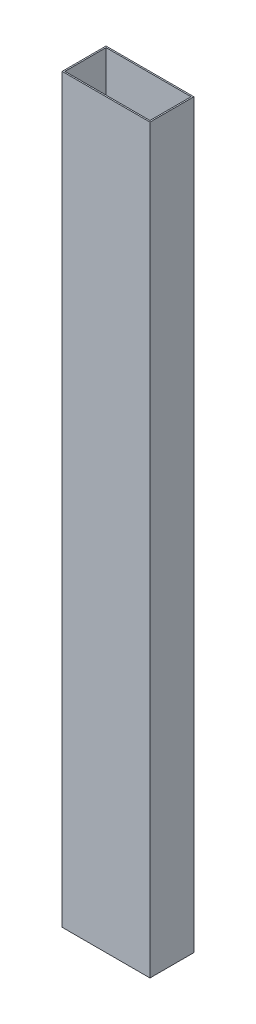
ISO-10303-21;
HEADER;
FILE_DESCRIPTION(('STEP AP214'),'2;1');
FILE_NAME('part.step','',(''),(''),'','','');
FILE_SCHEMA(('AUTOMOTIVE_DESIGN { 1 0 10303 214 1 1 1 1 }'));
ENDSEC;
DATA;
#1=APPLICATION_CONTEXT('core data for automotive mechanical design processes');
#2=APPLICATION_PROTOCOL_DEFINITION('international standard','automotive_design',2000,#1);
#3=PRODUCT_CONTEXT('',#1,'mechanical');
#4=PRODUCT('Part','Part','',(#3));
#5=PRODUCT_RELATED_PRODUCT_CATEGORY('part','',(#4));
#6=PRODUCT_DEFINITION_FORMATION('','',#4);
#7=PRODUCT_DEFINITION_CONTEXT('part definition',#1,'design');
#8=PRODUCT_DEFINITION('design','',#6,#7);
#9=PRODUCT_DEFINITION_SHAPE('','',#8);
#10=(LENGTH_UNIT() NAMED_UNIT(*) SI_UNIT(.MILLI.,.METRE.));
#11=(NAMED_UNIT(*) PLANE_ANGLE_UNIT() SI_UNIT($,.RADIAN.));
#12=(NAMED_UNIT(*) SI_UNIT($,.STERADIAN.) SOLID_ANGLE_UNIT());
#13=UNCERTAINTY_MEASURE_WITH_UNIT(LENGTH_MEASURE(1.E-05),#10,'distance_accuracy_value','');
#14=(GEOMETRIC_REPRESENTATION_CONTEXT(3) GLOBAL_UNCERTAINTY_ASSIGNED_CONTEXT((#13)) GLOBAL_UNIT_ASSIGNED_CONTEXT((#10,
#11,#12)) REPRESENTATION_CONTEXT('',''));
#15=CARTESIAN_POINT('',(0.,0.,0.));
#16=DIRECTION('',(0.,0.,1.));
#17=DIRECTION('',(1.,0.,0.));
#18=AXIS2_PLACEMENT_3D('',#15,#16,#17);
#19=CARTESIAN_POINT('',(25.4,762.,12.7));
#20=DIRECTION('',(-1.,0.,0.));
#21=DIRECTION('',(0.,0.,1.));
#22=AXIS2_PLACEMENT_3D('',#19,#20,#21);
#23=PLANE('',#22);
#24=DIRECTION('',(0.,0.,-1.));
#25=VECTOR('',#24,1.);
#26=CARTESIAN_POINT('',(25.4,428.625,-12.7));
#27=LINE('',#26,#25);
#28=CARTESIAN_POINT('',(25.4,428.625,12.7));
#29=VERTEX_POINT('',#28);
#30=CARTESIAN_POINT('',(25.4,428.625,-12.7));
#31=VERTEX_POINT('',#30);
#32=EDGE_CURVE('E101',#29,#31,#27,.T.);
#33=ORIENTED_EDGE('',*,*,#32,.F.);
#34=DIRECTION('',(0.,-1.,0.));
#35=VECTOR('',#34,1.);
#36=CARTESIAN_POINT('',(25.4,762.,12.7));
#37=LINE('',#36,#35);
#38=CARTESIAN_POINT('',(25.4,0.,12.7));
#39=VERTEX_POINT('',#38);
#40=EDGE_CURVE('E110',#29,#39,#37,.T.);
#41=ORIENTED_EDGE('',*,*,#40,.T.);
#42=DIRECTION('',(0.,0.,-1.));
#43=VECTOR('',#42,1.);
#44=CARTESIAN_POINT('',(25.4,0.,12.7));
#45=LINE('',#44,#43);
#46=CARTESIAN_POINT('',(25.4,0.,-12.7));
#47=VERTEX_POINT('',#46);
#48=EDGE_CURVE('E135',#39,#47,#45,.T.);
#49=ORIENTED_EDGE('',*,*,#48,.T.);
#50=DIRECTION('',(0.,-1.,0.));
#51=VECTOR('',#50,1.);
#52=CARTESIAN_POINT('',(25.4,762.,-12.7));
#53=LINE('',#52,#51);
#54=EDGE_CURVE('E45',#31,#47,#53,.T.);
#55=ORIENTED_EDGE('',*,*,#54,.F.);
#56=EDGE_LOOP('',(#33,#41,#49,#55));
#57=FACE_BOUND('',#56,.T.);
#58=ADVANCED_FACE('F38',(#57),#23,.F.);
#59=CARTESIAN_POINT('',(-25.4,762.,-12.7));
#60=DIRECTION('',(0.,0.,1.));
#61=DIRECTION('',(1.,0.,0.));
#62=AXIS2_PLACEMENT_3D('',#59,#60,#61);
#63=PLANE('',#62);
#64=DIRECTION('',(-1.,0.,0.));
#65=VECTOR('',#64,1.);
#66=CARTESIAN_POINT('',(-25.4,428.625,-12.7));
#67=LINE('',#66,#65);
#68=CARTESIAN_POINT('',(-25.4,428.625,-12.7));
#69=VERTEX_POINT('',#68);
#70=EDGE_CURVE('E112',#31,#69,#67,.T.);
#71=ORIENTED_EDGE('',*,*,#70,.F.);
#72=ORIENTED_EDGE('',*,*,#54,.T.);
#73=DIRECTION('',(-1.,0.,0.));
#74=VECTOR('',#73,1.);
#75=CARTESIAN_POINT('',(-25.4,0.,-12.7));
#76=LINE('',#75,#74);
#77=CARTESIAN_POINT('',(-25.4,0.,-12.7));
#78=VERTEX_POINT('',#77);
#79=EDGE_CURVE('E131',#47,#78,#76,.T.);
#80=ORIENTED_EDGE('',*,*,#79,.T.);
#81=DIRECTION('',(0.,-1.,0.));
#82=VECTOR('',#81,1.);
#83=CARTESIAN_POINT('',(-25.4,762.,-12.7));
#84=LINE('',#83,#82);
#85=EDGE_CURVE('E120',#69,#78,#84,.T.);
#86=ORIENTED_EDGE('',*,*,#85,.F.);
#87=EDGE_LOOP('',(#71,#72,#80,#86));
#88=FACE_BOUND('',#87,.T.);
#89=ADVANCED_FACE('F129',(#88),#63,.F.);
#90=CARTESIAN_POINT('',(-25.4,762.,12.7));
#91=DIRECTION('',(1.,0.,0.));
#92=DIRECTION('',(0.,0.,-1.));
#93=AXIS2_PLACEMENT_3D('',#90,#91,#92);
#94=PLANE('',#93);
#95=DIRECTION('',(0.,0.,1.));
#96=VECTOR('',#95,1.);
#97=CARTESIAN_POINT('',(-25.4,428.625,-12.7));
#98=LINE('',#97,#96);
#99=CARTESIAN_POINT('',(-25.4,428.625,12.7));
#100=VERTEX_POINT('',#99);
#101=EDGE_CURVE('E52',#69,#100,#98,.T.);
#102=ORIENTED_EDGE('',*,*,#101,.F.);
#103=ORIENTED_EDGE('',*,*,#85,.T.);
#104=DIRECTION('',(0.,0.,1.));
#105=VECTOR('',#104,1.);
#106=CARTESIAN_POINT('',(-25.4,0.,12.7));
#107=LINE('',#106,#105);
#108=CARTESIAN_POINT('',(-25.4,0.,12.7));
#109=VERTEX_POINT('',#108);
#110=EDGE_CURVE('E122',#78,#109,#107,.T.);
#111=ORIENTED_EDGE('',*,*,#110,.T.);
#112=DIRECTION('',(0.,-1.,0.));
#113=VECTOR('',#112,1.);
#114=CARTESIAN_POINT('',(-25.4,762.,12.7));
#115=LINE('',#114,#113);
#116=EDGE_CURVE('E118',#100,#109,#115,.T.);
#117=ORIENTED_EDGE('',*,*,#116,.F.);
#118=EDGE_LOOP('',(#102,#103,#111,#117));
#119=FACE_BOUND('',#118,.T.);
#120=ADVANCED_FACE('F146',(#119),#94,.F.);
#121=CARTESIAN_POINT('',(-25.4,762.,12.7));
#122=DIRECTION('',(0.,0.,-1.));
#123=DIRECTION('',(-1.,0.,0.));
#124=AXIS2_PLACEMENT_3D('',#121,#122,#123);
#125=PLANE('',#124);
#126=DIRECTION('',(1.,0.,0.));
#127=VECTOR('',#126,1.);
#128=CARTESIAN_POINT('',(-25.4,428.625,12.7));
#129=LINE('',#128,#127);
#130=EDGE_CURVE('E98',#100,#29,#129,.T.);
#131=ORIENTED_EDGE('',*,*,#130,.F.);
#132=ORIENTED_EDGE('',*,*,#116,.T.);
#133=DIRECTION('',(1.,0.,0.));
#134=VECTOR('',#133,1.);
#135=CARTESIAN_POINT('',(-25.4,0.,12.7));
#136=LINE('',#135,#134);
#137=EDGE_CURVE('E116',#109,#39,#136,.T.);
#138=ORIENTED_EDGE('',*,*,#137,.T.);
#139=ORIENTED_EDGE('',*,*,#40,.F.);
#140=EDGE_LOOP('',(#131,#132,#138,#139));
#141=FACE_BOUND('',#140,.T.);
#142=ADVANCED_FACE('F114',(#141),#125,.F.);
#143=CARTESIAN_POINT('',(24.5999,762.,11.8999));
#144=DIRECTION('',(1.,0.,0.));
#145=DIRECTION('',(0.,0.,-1.));
#146=AXIS2_PLACEMENT_3D('',#143,#144,#145);
#147=PLANE('',#146);
#148=DIRECTION('',(0.,0.,1.));
#149=VECTOR('',#148,1.);
#150=CARTESIAN_POINT('',(24.5999,428.625,11.8999));
#151=LINE('',#150,#149);
#152=CARTESIAN_POINT('',(24.5999,428.625,-11.8999));
#153=VERTEX_POINT('',#152);
#154=CARTESIAN_POINT('',(24.5999,428.625,11.8999));
#155=VERTEX_POINT('',#154);
#156=EDGE_CURVE('E59',#153,#155,#151,.T.);
#157=ORIENTED_EDGE('',*,*,#156,.F.);
#158=DIRECTION('',(0.,-1.,0.));
#159=VECTOR('',#158,1.);
#160=CARTESIAN_POINT('',(24.5999,762.,-11.8999));
#161=LINE('',#160,#159);
#162=CARTESIAN_POINT('',(24.5999,0.,-11.8999));
#163=VERTEX_POINT('',#162);
#164=EDGE_CURVE('E138',#153,#163,#161,.T.);
#165=ORIENTED_EDGE('',*,*,#164,.T.);
#166=DIRECTION('',(0.,0.,1.));
#167=VECTOR('',#166,1.);
#168=CARTESIAN_POINT('',(24.5999,0.,11.8999));
#169=LINE('',#168,#167);
#170=CARTESIAN_POINT('',(24.5999,0.,11.8999));
#171=VERTEX_POINT('',#170);
#172=EDGE_CURVE('E155',#163,#171,#169,.T.);
#173=ORIENTED_EDGE('',*,*,#172,.T.);
#174=DIRECTION('',(0.,-1.,0.));
#175=VECTOR('',#174,1.);
#176=CARTESIAN_POINT('',(24.5999,762.,11.8999));
#177=LINE('',#176,#175);
#178=EDGE_CURVE('E143',#155,#171,#177,.T.);
#179=ORIENTED_EDGE('',*,*,#178,.F.);
#180=EDGE_LOOP('',(#157,#165,#173,#179));
#181=FACE_BOUND('',#180,.T.);
#182=ADVANCED_FACE('F178',(#181),#147,.F.);
#183=CARTESIAN_POINT('',(-24.5999,762.,-11.8999));
#184=DIRECTION('',(0.,0.,-1.));
#185=DIRECTION('',(-1.,0.,0.));
#186=AXIS2_PLACEMENT_3D('',#183,#184,#185);
#187=PLANE('',#186);
#188=DIRECTION('',(1.,0.,0.));
#189=VECTOR('',#188,1.);
#190=CARTESIAN_POINT('',(-24.5999,428.625,-11.8999));
#191=LINE('',#190,#189);
#192=CARTESIAN_POINT('',(-24.5999,428.625,-11.8999));
#193=VERTEX_POINT('',#192);
#194=EDGE_CURVE('E152',#193,#153,#191,.T.);
#195=ORIENTED_EDGE('',*,*,#194,.F.);
#196=DIRECTION('',(0.,-1.,0.));
#197=VECTOR('',#196,1.);
#198=CARTESIAN_POINT('',(-24.5999,762.,-11.8999));
#199=LINE('',#198,#197);
#200=CARTESIAN_POINT('',(-24.5999,0.,-11.8999));
#201=VERTEX_POINT('',#200);
#202=EDGE_CURVE('E140',#193,#201,#199,.T.);
#203=ORIENTED_EDGE('',*,*,#202,.T.);
#204=DIRECTION('',(1.,0.,0.));
#205=VECTOR('',#204,1.);
#206=CARTESIAN_POINT('',(-24.5999,0.,-11.8999));
#207=LINE('',#206,#205);
#208=EDGE_CURVE('E164',#201,#163,#207,.T.);
#209=ORIENTED_EDGE('',*,*,#208,.T.);
#210=ORIENTED_EDGE('',*,*,#164,.F.);
#211=EDGE_LOOP('',(#195,#203,#209,#210));
#212=FACE_BOUND('',#211,.T.);
#213=ADVANCED_FACE('F186',(#212),#187,.F.);
#214=CARTESIAN_POINT('',(-24.5999,762.,11.8999));
#215=DIRECTION('',(-1.,0.,0.));
#216=DIRECTION('',(0.,0.,1.));
#217=AXIS2_PLACEMENT_3D('',#214,#215,#216);
#218=PLANE('',#217);
#219=DIRECTION('',(0.,0.,-1.));
#220=VECTOR('',#219,1.);
#221=CARTESIAN_POINT('',(-24.5999,428.625,11.8999));
#222=LINE('',#221,#220);
#223=CARTESIAN_POINT('',(-24.5999,428.625,11.8999));
#224=VERTEX_POINT('',#223);
#225=EDGE_CURVE('E150',#224,#193,#222,.T.);
#226=ORIENTED_EDGE('',*,*,#225,.F.);
#227=DIRECTION('',(0.,-1.,0.));
#228=VECTOR('',#227,1.);
#229=CARTESIAN_POINT('',(-24.5999,762.,11.8999));
#230=LINE('',#229,#228);
#231=CARTESIAN_POINT('',(-24.5999,0.,11.8999));
#232=VERTEX_POINT('',#231);
#233=EDGE_CURVE('E167',#224,#232,#230,.T.);
#234=ORIENTED_EDGE('',*,*,#233,.T.);
#235=DIRECTION('',(0.,0.,-1.));
#236=VECTOR('',#235,1.);
#237=CARTESIAN_POINT('',(-24.5999,0.,11.8999));
#238=LINE('',#237,#236);
#239=EDGE_CURVE('E161',#232,#201,#238,.T.);
#240=ORIENTED_EDGE('',*,*,#239,.T.);
#241=ORIENTED_EDGE('',*,*,#202,.F.);
#242=EDGE_LOOP('',(#226,#234,#240,#241));
#243=FACE_BOUND('',#242,.T.);
#244=ADVANCED_FACE('F183',(#243),#218,.F.);
#245=CARTESIAN_POINT('',(-24.5999,762.,11.8999));
#246=DIRECTION('',(0.,0.,1.));
#247=DIRECTION('',(1.,0.,0.));
#248=AXIS2_PLACEMENT_3D('',#245,#246,#247);
#249=PLANE('',#248);
#250=DIRECTION('',(-1.,0.,0.));
#251=VECTOR('',#250,1.);
#252=CARTESIAN_POINT('',(-24.5999,428.625,11.8999));
#253=LINE('',#252,#251);
#254=EDGE_CURVE('E11',#155,#224,#253,.T.);
#255=ORIENTED_EDGE('',*,*,#254,.F.);
#256=ORIENTED_EDGE('',*,*,#178,.T.);
#257=DIRECTION('',(-1.,0.,0.));
#258=VECTOR('',#257,1.);
#259=CARTESIAN_POINT('',(-24.5999,0.,11.8999));
#260=LINE('',#259,#258);
#261=EDGE_CURVE('E158',#171,#232,#260,.T.);
#262=ORIENTED_EDGE('',*,*,#261,.T.);
#263=ORIENTED_EDGE('',*,*,#233,.F.);
#264=EDGE_LOOP('',(#255,#256,#262,#263));
#265=FACE_BOUND('',#264,.T.);
#266=ADVANCED_FACE('F173',(#265),#249,.F.);
#267=CARTESIAN_POINT('',(0.,0.,0.));
#268=DIRECTION('',(0.,-1.,0.));
#269=DIRECTION('',(0.,0.,-1.));
#270=AXIS2_PLACEMENT_3D('',#267,#268,#269);
#271=PLANE('',#270);
#272=ORIENTED_EDGE('',*,*,#172,.F.);
#273=ORIENTED_EDGE('',*,*,#208,.F.);
#274=ORIENTED_EDGE('',*,*,#239,.F.);
#275=ORIENTED_EDGE('',*,*,#261,.F.);
#276=EDGE_LOOP('',(#272,#273,#274,#275));
#277=FACE_BOUND('',#276,.T.);
#278=ORIENTED_EDGE('',*,*,#48,.F.);
#279=ORIENTED_EDGE('',*,*,#137,.F.);
#280=ORIENTED_EDGE('',*,*,#110,.F.);
#281=ORIENTED_EDGE('',*,*,#79,.F.);
#282=EDGE_LOOP('',(#278,#279,#280,#281));
#283=FACE_BOUND('',#282,.T.);
#284=ADVANCED_FACE('F134',(#277,#283),#271,.T.);
#285=CARTESIAN_POINT('',(0.,428.625,0.));
#286=DIRECTION('',(0.,1.,0.));
#287=DIRECTION('',(0.,0.,1.));
#288=AXIS2_PLACEMENT_3D('',#285,#286,#287);
#289=PLANE('',#288);
#290=ORIENTED_EDGE('',*,*,#101,.T.);
#291=ORIENTED_EDGE('',*,*,#130,.T.);
#292=ORIENTED_EDGE('',*,*,#32,.T.);
#293=ORIENTED_EDGE('',*,*,#70,.T.);
#294=EDGE_LOOP('',(#290,#291,#292,#293));
#295=FACE_BOUND('',#294,.T.);
#296=ORIENTED_EDGE('',*,*,#156,.T.);
#297=ORIENTED_EDGE('',*,*,#254,.T.);
#298=ORIENTED_EDGE('',*,*,#225,.T.);
#299=ORIENTED_EDGE('',*,*,#194,.T.);
#300=EDGE_LOOP('',(#296,#297,#298,#299));
#301=FACE_BOUND('',#300,.T.);
#302=ADVANCED_FACE('F100',(#295,#301),#289,.T.);
#303=CLOSED_SHELL('',(#58,#89,#120,#142,#182,#213,#244,#266,#284,#302));
#304=MANIFOLD_SOLID_BREP('B2',#303);
#305=ADVANCED_BREP_SHAPE_REPRESENTATION('',(#18,#304),#14);
#306=SHAPE_DEFINITION_REPRESENTATION(#9,#305);
ENDSEC;
END-ISO-10303-21;
